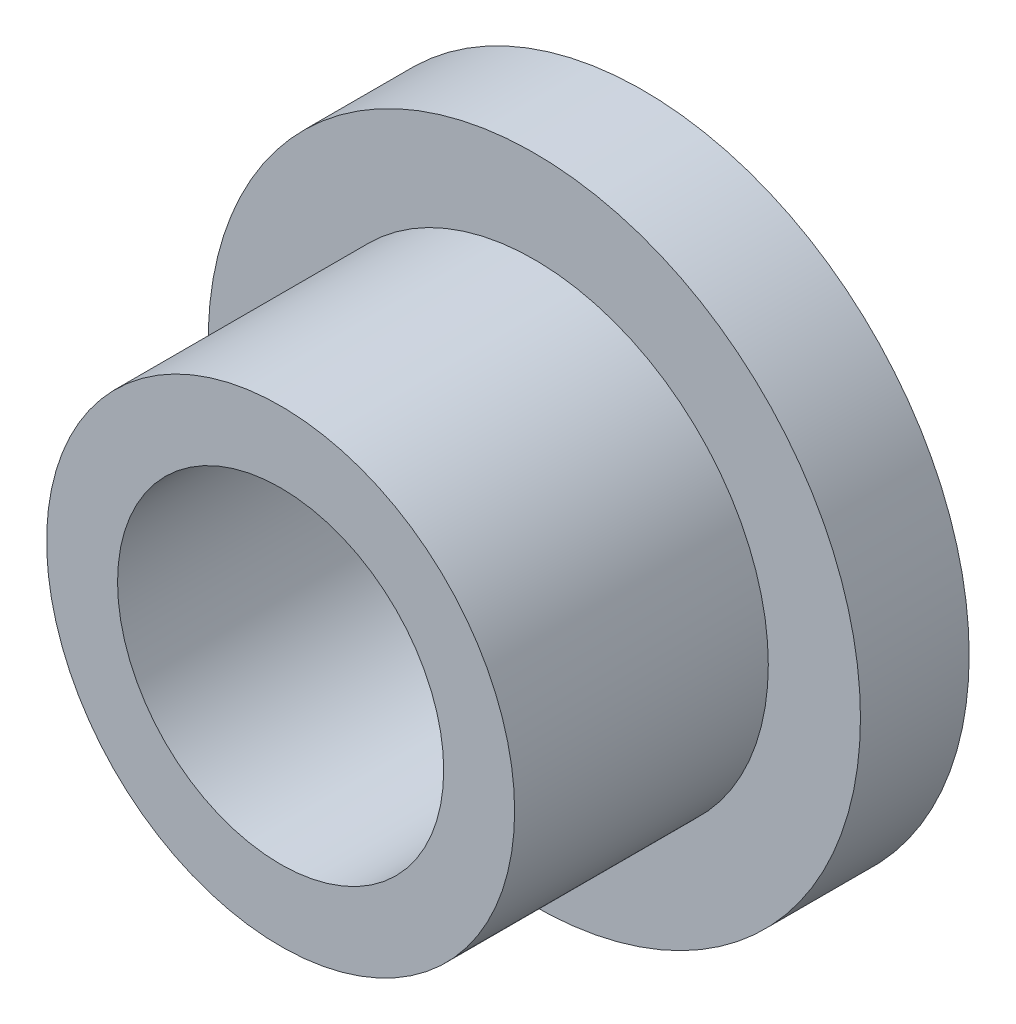
ISO-10303-21;
HEADER;
FILE_DESCRIPTION(('STEP AP214'),'2;1');
FILE_NAME('part.step','',(''),(''),'','','');
FILE_SCHEMA(('AUTOMOTIVE_DESIGN { 1 0 10303 214 1 1 1 1 }'));
ENDSEC;
DATA;
#1=APPLICATION_CONTEXT('core data for automotive mechanical design processes');
#2=APPLICATION_PROTOCOL_DEFINITION('international standard','automotive_design',2000,#1);
#3=PRODUCT_CONTEXT('',#1,'mechanical');
#4=PRODUCT('Part','Part','',(#3));
#5=PRODUCT_RELATED_PRODUCT_CATEGORY('part','',(#4));
#6=PRODUCT_DEFINITION_FORMATION('','',#4);
#7=PRODUCT_DEFINITION_CONTEXT('part definition',#1,'design');
#8=PRODUCT_DEFINITION('design','',#6,#7);
#9=PRODUCT_DEFINITION_SHAPE('','',#8);
#10=(LENGTH_UNIT() NAMED_UNIT(*) SI_UNIT(.MILLI.,.METRE.));
#11=(NAMED_UNIT(*) PLANE_ANGLE_UNIT() SI_UNIT($,.RADIAN.));
#12=(NAMED_UNIT(*) SI_UNIT($,.STERADIAN.) SOLID_ANGLE_UNIT());
#13=UNCERTAINTY_MEASURE_WITH_UNIT(LENGTH_MEASURE(1.E-05),#10,'distance_accuracy_value','');
#14=(GEOMETRIC_REPRESENTATION_CONTEXT(3) GLOBAL_UNCERTAINTY_ASSIGNED_CONTEXT((#13)) GLOBAL_UNIT_ASSIGNED_CONTEXT((#10,
#11,#12)) REPRESENTATION_CONTEXT('',''));
#15=CARTESIAN_POINT('',(0.,0.,0.));
#16=DIRECTION('',(0.,0.,1.));
#17=DIRECTION('',(1.,0.,0.));
#18=AXIS2_PLACEMENT_3D('',#15,#16,#17);
#19=CARTESIAN_POINT('',(0.,0.,10.));
#20=DIRECTION('',(0.,0.,1.));
#21=DIRECTION('',(1.,0.,0.));
#22=AXIS2_PLACEMENT_3D('',#19,#20,#21);
#23=PLANE('',#22);
#24=CARTESIAN_POINT('',(0.,0.,10.));
#25=DIRECTION('',(0.,0.,1.));
#26=DIRECTION('',(1.,0.,0.));
#27=AXIS2_PLACEMENT_3D('',#24,#25,#26);
#28=CIRCLE('',#27,4.5);
#29=CARTESIAN_POINT('',(4.5,0.,10.));
#30=VERTEX_POINT('',#29);
#31=EDGE_CURVE('E36',#30,#30,#28,.T.);
#32=ORIENTED_EDGE('',*,*,#31,.F.);
#33=EDGE_LOOP('',(#32));
#34=FACE_BOUND('',#33,.T.);
#35=CARTESIAN_POINT('',(0.,0.,10.));
#36=DIRECTION('',(0.,0.,1.));
#37=DIRECTION('',(1.,0.,0.));
#38=AXIS2_PLACEMENT_3D('',#35,#36,#37);
#39=CIRCLE('',#38,6.45717309788096);
#40=CARTESIAN_POINT('',(6.45717309788096,0.,10.));
#41=VERTEX_POINT('',#40);
#42=EDGE_CURVE('E50',#41,#41,#39,.T.);
#43=ORIENTED_EDGE('',*,*,#42,.T.);
#44=EDGE_LOOP('',(#43));
#45=FACE_BOUND('',#44,.T.);
#46=ADVANCED_FACE('F29',(#34,#45),#23,.T.);
#47=CARTESIAN_POINT('',(0.,0.,10.));
#48=DIRECTION('',(0.,0.,-1.));
#49=DIRECTION('',(-1.,0.,0.));
#50=AXIS2_PLACEMENT_3D('',#47,#48,#49);
#51=CYLINDRICAL_SURFACE('',#50,9.);
#52=CARTESIAN_POINT('',(0.,0.,0.));
#53=DIRECTION('',(0.,0.,1.));
#54=DIRECTION('',(1.,0.,0.));
#55=AXIS2_PLACEMENT_3D('',#52,#53,#54);
#56=CIRCLE('',#55,9.);
#57=CARTESIAN_POINT('',(9.,0.,0.));
#58=VERTEX_POINT('',#57);
#59=EDGE_CURVE('E10',#58,#58,#56,.T.);
#60=ORIENTED_EDGE('',*,*,#59,.T.);
#61=EDGE_LOOP('',(#60));
#62=FACE_BOUND('',#61,.T.);
#63=CARTESIAN_POINT('',(0.,0.,3.));
#64=DIRECTION('',(0.,0.,1.));
#65=DIRECTION('',(1.,0.,0.));
#66=AXIS2_PLACEMENT_3D('',#63,#64,#65);
#67=CIRCLE('',#66,9.);
#68=CARTESIAN_POINT('',(9.,0.,3.));
#69=VERTEX_POINT('',#68);
#70=EDGE_CURVE('E45',#69,#69,#67,.T.);
#71=ORIENTED_EDGE('',*,*,#70,.F.);
#72=EDGE_LOOP('',(#71));
#73=FACE_BOUND('',#72,.T.);
#74=ADVANCED_FACE('F31',(#62,#73),#51,.T.);
#75=CARTESIAN_POINT('',(0.,0.,0.));
#76=DIRECTION('',(0.,0.,1.));
#77=DIRECTION('',(1.,0.,0.));
#78=AXIS2_PLACEMENT_3D('',#75,#76,#77);
#79=PLANE('',#78);
#80=ORIENTED_EDGE('',*,*,#59,.F.);
#81=EDGE_LOOP('',(#80));
#82=FACE_BOUND('',#81,.T.);
#83=CARTESIAN_POINT('',(0.,0.,0.));
#84=DIRECTION('',(0.,0.,1.));
#85=DIRECTION('',(1.,0.,0.));
#86=AXIS2_PLACEMENT_3D('',#83,#84,#85);
#87=CIRCLE('',#86,4.5);
#88=CARTESIAN_POINT('',(4.5,0.,0.));
#89=VERTEX_POINT('',#88);
#90=EDGE_CURVE('E40',#89,#89,#87,.T.);
#91=ORIENTED_EDGE('',*,*,#90,.T.);
#92=EDGE_LOOP('',(#91));
#93=FACE_BOUND('',#92,.T.);
#94=ADVANCED_FACE('F67',(#82,#93),#79,.F.);
#95=CARTESIAN_POINT('',(0.,0.,10.));
#96=DIRECTION('',(0.,0.,-1.));
#97=DIRECTION('',(-1.,0.,0.));
#98=AXIS2_PLACEMENT_3D('',#95,#96,#97);
#99=CYLINDRICAL_SURFACE('',#98,4.5);
#100=ORIENTED_EDGE('',*,*,#31,.T.);
#101=EDGE_LOOP('',(#100));
#102=FACE_BOUND('',#101,.T.);
#103=ORIENTED_EDGE('',*,*,#90,.F.);
#104=EDGE_LOOP('',(#103));
#105=FACE_BOUND('',#104,.T.);
#106=ADVANCED_FACE('F62',(#102,#105),#99,.F.);
#107=CARTESIAN_POINT('',(0.,0.,3.));
#108=DIRECTION('',(0.,0.,1.));
#109=DIRECTION('',(1.,0.,0.));
#110=AXIS2_PLACEMENT_3D('',#107,#108,#109);
#111=PLANE('',#110);
#112=CARTESIAN_POINT('',(0.,0.,3.));
#113=DIRECTION('',(0.,0.,1.));
#114=DIRECTION('',(1.,0.,0.));
#115=AXIS2_PLACEMENT_3D('',#112,#113,#114);
#116=CIRCLE('',#115,6.45717309788096);
#117=CARTESIAN_POINT('',(6.45717309788096,0.,3.));
#118=VERTEX_POINT('',#117);
#119=EDGE_CURVE('E49',#118,#118,#116,.T.);
#120=ORIENTED_EDGE('',*,*,#119,.F.);
#121=EDGE_LOOP('',(#120));
#122=FACE_BOUND('',#121,.T.);
#123=ORIENTED_EDGE('',*,*,#70,.T.);
#124=EDGE_LOOP('',(#123));
#125=FACE_BOUND('',#124,.T.);
#126=ADVANCED_FACE('F59',(#122,#125),#111,.T.);
#127=CARTESIAN_POINT('',(0.,0.,3.));
#128=DIRECTION('',(0.,0.,1.));
#129=DIRECTION('',(1.,0.,0.));
#130=AXIS2_PLACEMENT_3D('',#127,#128,#129);
#131=CYLINDRICAL_SURFACE('',#130,6.45717309788096);
#132=ORIENTED_EDGE('',*,*,#119,.T.);
#133=EDGE_LOOP('',(#132));
#134=FACE_BOUND('',#133,.T.);
#135=ORIENTED_EDGE('',*,*,#42,.F.);
#136=EDGE_LOOP('',(#135));
#137=FACE_BOUND('',#136,.T.);
#138=ADVANCED_FACE('F56',(#134,#137),#131,.T.);
#139=CLOSED_SHELL('',(#46,#74,#94,#106,#126,#138));
#140=MANIFOLD_SOLID_BREP('B2',#139);
#141=ADVANCED_BREP_SHAPE_REPRESENTATION('',(#18,#140),#14);
#142=SHAPE_DEFINITION_REPRESENTATION(#9,#141);
ENDSEC;
END-ISO-10303-21;
